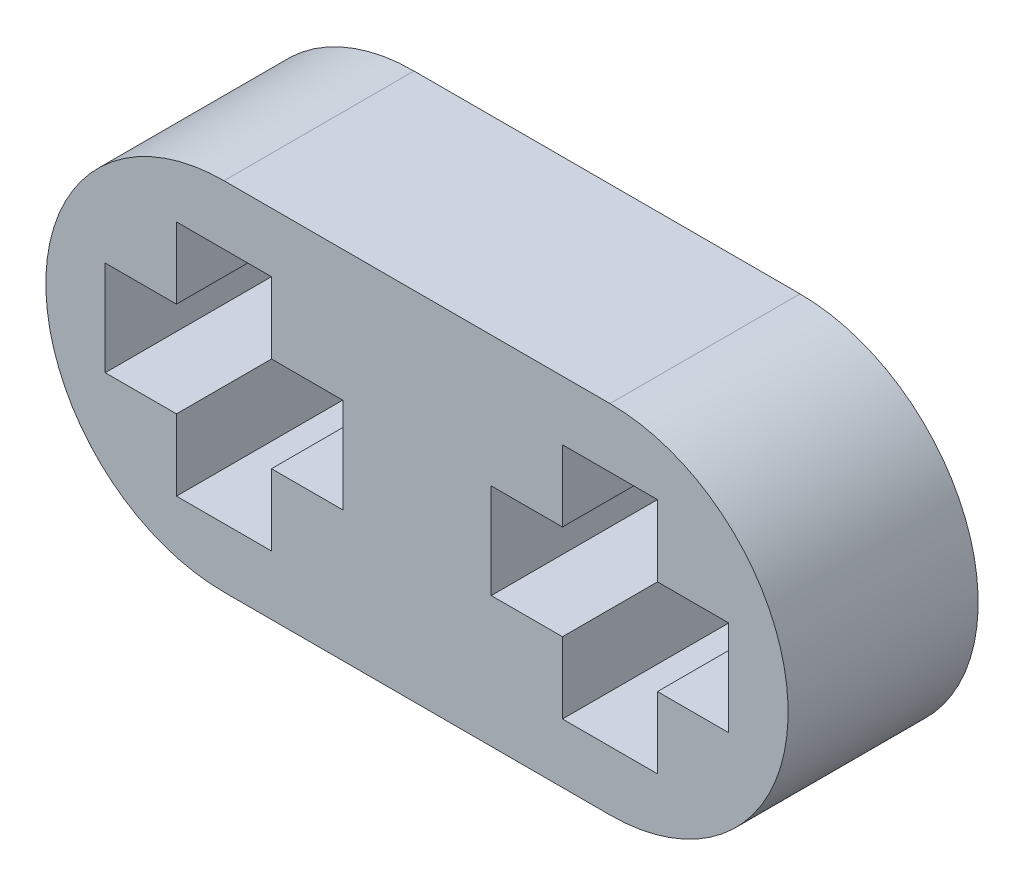
ISO-10303-21;
HEADER;
FILE_DESCRIPTION(('STEP AP214'),'2;1');
FILE_NAME('part.step','',(''),(''),'','','');
FILE_SCHEMA(('AUTOMOTIVE_DESIGN { 1 0 10303 214 1 1 1 1 }'));
ENDSEC;
DATA;
#1=APPLICATION_CONTEXT('core data for automotive mechanical design processes');
#2=APPLICATION_PROTOCOL_DEFINITION('international standard','automotive_design',2000,#1);
#3=PRODUCT_CONTEXT('',#1,'mechanical');
#4=PRODUCT('Part','Part','',(#3));
#5=PRODUCT_RELATED_PRODUCT_CATEGORY('part','',(#4));
#6=PRODUCT_DEFINITION_FORMATION('','',#4);
#7=PRODUCT_DEFINITION_CONTEXT('part definition',#1,'design');
#8=PRODUCT_DEFINITION('design','',#6,#7);
#9=PRODUCT_DEFINITION_SHAPE('','',#8);
#10=(LENGTH_UNIT() NAMED_UNIT(*) SI_UNIT(.MILLI.,.METRE.));
#11=(NAMED_UNIT(*) PLANE_ANGLE_UNIT() SI_UNIT($,.RADIAN.));
#12=(NAMED_UNIT(*) SI_UNIT($,.STERADIAN.) SOLID_ANGLE_UNIT());
#13=UNCERTAINTY_MEASURE_WITH_UNIT(LENGTH_MEASURE(1.E-05),#10,'distance_accuracy_value','');
#14=(GEOMETRIC_REPRESENTATION_CONTEXT(3) GLOBAL_UNCERTAINTY_ASSIGNED_CONTEXT((#13)) GLOBAL_UNIT_ASSIGNED_CONTEXT((#10,
#11,#12)) REPRESENTATION_CONTEXT('',''));
#15=CARTESIAN_POINT('',(0.,0.,0.));
#16=DIRECTION('',(0.,0.,1.));
#17=DIRECTION('',(1.,0.,0.));
#18=AXIS2_PLACEMENT_3D('',#15,#16,#17);
#19=CARTESIAN_POINT('',(4.0625,-3.75,4.));
#20=DIRECTION('',(0.,-1.,0.));
#21=DIRECTION('',(0.,0.,-1.));
#22=AXIS2_PLACEMENT_3D('',#19,#20,#21);
#23=PLANE('',#22);
#24=DIRECTION('',(-1.,0.,0.));
#25=VECTOR('',#24,1.);
#26=CARTESIAN_POINT('',(4.0625,-3.75,0.));
#27=LINE('',#26,#25);
#28=CARTESIAN_POINT('',(8.125,-3.75,0.));
#29=VERTEX_POINT('',#28);
#30=CARTESIAN_POINT('',(0.,-3.75,0.));
#31=VERTEX_POINT('',#30);
#32=EDGE_CURVE('E312',#29,#31,#27,.T.);
#33=ORIENTED_EDGE('',*,*,#32,.F.);
#34=DIRECTION('',(0.,0.,-1.));
#35=VECTOR('',#34,1.);
#36=CARTESIAN_POINT('',(8.125,-3.75,4.));
#37=LINE('',#36,#35);
#38=CARTESIAN_POINT('',(8.125,-3.75,4.));
#39=VERTEX_POINT('',#38);
#40=EDGE_CURVE('E11',#39,#29,#37,.T.);
#41=ORIENTED_EDGE('',*,*,#40,.F.);
#42=DIRECTION('',(-1.,0.,0.));
#43=VECTOR('',#42,1.);
#44=CARTESIAN_POINT('',(4.0625,-3.75,4.));
#45=LINE('',#44,#43);
#46=CARTESIAN_POINT('',(0.,-3.75,4.));
#47=VERTEX_POINT('',#46);
#48=EDGE_CURVE('E234',#39,#47,#45,.T.);
#49=ORIENTED_EDGE('',*,*,#48,.T.);
#50=DIRECTION('',(0.,0.,-1.));
#51=VECTOR('',#50,1.);
#52=CARTESIAN_POINT('',(0.,-3.75,4.));
#53=LINE('',#52,#51);
#54=EDGE_CURVE('E147',#47,#31,#53,.T.);
#55=ORIENTED_EDGE('',*,*,#54,.T.);
#56=EDGE_LOOP('',(#33,#41,#49,#55));
#57=FACE_BOUND('',#56,.T.);
#58=ADVANCED_FACE('F34',(#57),#23,.T.);
#59=CARTESIAN_POINT('',(8.125,0.,4.));
#60=DIRECTION('',(0.,0.,-1.));
#61=DIRECTION('',(-1.,0.,0.));
#62=AXIS2_PLACEMENT_3D('',#59,#60,#61);
#63=CYLINDRICAL_SURFACE('',#62,3.75);
#64=CARTESIAN_POINT('',(8.125,0.,0.));
#65=DIRECTION('',(0.,0.,1.));
#66=DIRECTION('',(1.,0.,0.));
#67=AXIS2_PLACEMENT_3D('',#64,#65,#66);
#68=CIRCLE('',#67,3.75);
#69=CARTESIAN_POINT('',(8.125,3.75,0.));
#70=VERTEX_POINT('',#69);
#71=EDGE_CURVE('E240',#29,#70,#68,.T.);
#72=ORIENTED_EDGE('',*,*,#71,.T.);
#73=DIRECTION('',(0.,0.,-1.));
#74=VECTOR('',#73,1.);
#75=CARTESIAN_POINT('',(8.125,3.75,4.));
#76=LINE('',#75,#74);
#77=CARTESIAN_POINT('',(8.125,3.75,4.));
#78=VERTEX_POINT('',#77);
#79=EDGE_CURVE('E44',#78,#70,#76,.T.);
#80=ORIENTED_EDGE('',*,*,#79,.F.);
#81=CARTESIAN_POINT('',(8.125,0.,4.));
#82=DIRECTION('',(0.,0.,1.));
#83=DIRECTION('',(1.,0.,0.));
#84=AXIS2_PLACEMENT_3D('',#81,#82,#83);
#85=CIRCLE('',#84,3.75);
#86=EDGE_CURVE('E229',#39,#78,#85,.T.);
#87=ORIENTED_EDGE('',*,*,#86,.F.);
#88=ORIENTED_EDGE('',*,*,#40,.T.);
#89=EDGE_LOOP('',(#72,#80,#87,#88));
#90=FACE_BOUND('',#89,.T.);
#91=ADVANCED_FACE('F238',(#90),#63,.T.);
#92=CARTESIAN_POINT('',(4.0625,3.75,4.));
#93=DIRECTION('',(0.,1.,0.));
#94=DIRECTION('',(0.,0.,1.));
#95=AXIS2_PLACEMENT_3D('',#92,#93,#94);
#96=PLANE('',#95);
#97=DIRECTION('',(1.,0.,0.));
#98=VECTOR('',#97,1.);
#99=CARTESIAN_POINT('',(4.0625,3.75,0.));
#100=LINE('',#99,#98);
#101=CARTESIAN_POINT('',(0.,3.75,0.));
#102=VERTEX_POINT('',#101);
#103=EDGE_CURVE('E316',#102,#70,#100,.T.);
#104=ORIENTED_EDGE('',*,*,#103,.F.);
#105=DIRECTION('',(0.,0.,-1.));
#106=VECTOR('',#105,1.);
#107=CARTESIAN_POINT('',(0.,3.75,4.));
#108=LINE('',#107,#106);
#109=CARTESIAN_POINT('',(0.,3.75,4.));
#110=VERTEX_POINT('',#109);
#111=EDGE_CURVE('E140',#110,#102,#108,.T.);
#112=ORIENTED_EDGE('',*,*,#111,.F.);
#113=DIRECTION('',(1.,0.,0.));
#114=VECTOR('',#113,1.);
#115=CARTESIAN_POINT('',(4.0625,3.75,4.));
#116=LINE('',#115,#114);
#117=EDGE_CURVE('E233',#110,#78,#116,.T.);
#118=ORIENTED_EDGE('',*,*,#117,.T.);
#119=ORIENTED_EDGE('',*,*,#79,.T.);
#120=EDGE_LOOP('',(#104,#112,#118,#119));
#121=FACE_BOUND('',#120,.T.);
#122=ADVANCED_FACE('F245',(#121),#96,.T.);
#123=CARTESIAN_POINT('',(4.0625,2.5,4.));
#124=DIRECTION('',(0.,-1.,0.));
#125=DIRECTION('',(0.,0.,-1.));
#126=AXIS2_PLACEMENT_3D('',#123,#124,#125);
#127=PLANE('',#126);
#128=DIRECTION('',(-1.,0.,0.));
#129=VECTOR('',#128,1.);
#130=CARTESIAN_POINT('',(4.0625,2.5,0.));
#131=LINE('',#130,#129);
#132=CARTESIAN_POINT('',(0.999999999999999,2.5,0.));
#133=VERTEX_POINT('',#132);
#134=CARTESIAN_POINT('',(-1.,2.5,0.));
#135=VERTEX_POINT('',#134);
#136=EDGE_CURVE('E276',#133,#135,#131,.T.);
#137=ORIENTED_EDGE('',*,*,#136,.F.);
#138=DIRECTION('',(0.,0.,-1.));
#139=VECTOR('',#138,1.);
#140=CARTESIAN_POINT('',(0.999999999999999,2.5,4.));
#141=LINE('',#140,#139);
#142=CARTESIAN_POINT('',(0.999999999999999,2.5,4.));
#143=VERTEX_POINT('',#142);
#144=EDGE_CURVE('E322',#143,#133,#141,.T.);
#145=ORIENTED_EDGE('',*,*,#144,.F.);
#146=DIRECTION('',(-1.,0.,0.));
#147=VECTOR('',#146,1.);
#148=CARTESIAN_POINT('',(4.0625,2.5,4.));
#149=LINE('',#148,#147);
#150=CARTESIAN_POINT('',(-1.,2.5,4.));
#151=VERTEX_POINT('',#150);
#152=EDGE_CURVE('E423',#143,#151,#149,.T.);
#153=ORIENTED_EDGE('',*,*,#152,.T.);
#154=DIRECTION('',(0.,0.,-1.));
#155=VECTOR('',#154,1.);
#156=CARTESIAN_POINT('',(-1.,2.5,4.));
#157=LINE('',#156,#155);
#158=EDGE_CURVE('E324',#151,#135,#157,.T.);
#159=ORIENTED_EDGE('',*,*,#158,.T.);
#160=EDGE_LOOP('',(#137,#145,#153,#159));
#161=FACE_BOUND('',#160,.T.);
#162=ADVANCED_FACE('F523',(#161),#127,.T.);
#163=CARTESIAN_POINT('',(0.999999999999999,-13.6223830476375,4.));
#164=DIRECTION('',(-1.,0.,0.));
#165=DIRECTION('',(0.,0.,1.));
#166=AXIS2_PLACEMENT_3D('',#163,#164,#165);
#167=PLANE('',#166);
#168=DIRECTION('',(0.,1.,0.));
#169=VECTOR('',#168,1.);
#170=CARTESIAN_POINT('',(0.999999999999999,-13.6223830476375,0.));
#171=LINE('',#170,#169);
#172=CARTESIAN_POINT('',(0.999999999999999,0.999999999999999,0.));
#173=VERTEX_POINT('',#172);
#174=EDGE_CURVE('E279',#173,#133,#171,.T.);
#175=ORIENTED_EDGE('',*,*,#174,.F.);
#176=DIRECTION('',(0.,0.,-1.));
#177=VECTOR('',#176,1.);
#178=CARTESIAN_POINT('',(0.999999999999999,0.999999999999999,4.));
#179=LINE('',#178,#177);
#180=CARTESIAN_POINT('',(0.999999999999999,0.999999999999999,4.));
#181=VERTEX_POINT('',#180);
#182=EDGE_CURVE('E344',#181,#173,#179,.T.);
#183=ORIENTED_EDGE('',*,*,#182,.F.);
#184=DIRECTION('',(0.,1.,0.));
#185=VECTOR('',#184,1.);
#186=CARTESIAN_POINT('',(0.999999999999999,-13.6223830476375,4.));
#187=LINE('',#186,#185);
#188=EDGE_CURVE('E426',#181,#143,#187,.T.);
#189=ORIENTED_EDGE('',*,*,#188,.T.);
#190=ORIENTED_EDGE('',*,*,#144,.T.);
#191=EDGE_LOOP('',(#175,#183,#189,#190));
#192=FACE_BOUND('',#191,.T.);
#193=ADVANCED_FACE('F519',(#192),#167,.T.);
#194=CARTESIAN_POINT('',(4.0625,1.,4.));
#195=DIRECTION('',(0.,-1.,0.));
#196=DIRECTION('',(0.,0.,-1.));
#197=AXIS2_PLACEMENT_3D('',#194,#195,#196);
#198=PLANE('',#197);
#199=DIRECTION('',(-1.,0.,0.));
#200=VECTOR('',#199,1.);
#201=CARTESIAN_POINT('',(4.0625,1.,0.));
#202=LINE('',#201,#200);
#203=CARTESIAN_POINT('',(2.5,1.,0.));
#204=VERTEX_POINT('',#203);
#205=EDGE_CURVE('E282',#204,#173,#202,.T.);
#206=ORIENTED_EDGE('',*,*,#205,.F.);
#207=DIRECTION('',(0.,0.,-1.));
#208=VECTOR('',#207,1.);
#209=CARTESIAN_POINT('',(2.5,1.,4.));
#210=LINE('',#209,#208);
#211=CARTESIAN_POINT('',(2.5,1.,4.));
#212=VERTEX_POINT('',#211);
#213=EDGE_CURVE('E342',#212,#204,#210,.T.);
#214=ORIENTED_EDGE('',*,*,#213,.F.);
#215=DIRECTION('',(-1.,0.,0.));
#216=VECTOR('',#215,1.);
#217=CARTESIAN_POINT('',(4.0625,1.,4.));
#218=LINE('',#217,#216);
#219=EDGE_CURVE('E429',#212,#181,#218,.T.);
#220=ORIENTED_EDGE('',*,*,#219,.T.);
#221=ORIENTED_EDGE('',*,*,#182,.T.);
#222=EDGE_LOOP('',(#206,#214,#220,#221));
#223=FACE_BOUND('',#222,.T.);
#224=ADVANCED_FACE('F515',(#223),#198,.T.);
#225=CARTESIAN_POINT('',(2.5,-13.6223830476375,4.));
#226=DIRECTION('',(-1.,0.,0.));
#227=DIRECTION('',(0.,0.,1.));
#228=AXIS2_PLACEMENT_3D('',#225,#226,#227);
#229=PLANE('',#228);
#230=DIRECTION('',(0.,1.,0.));
#231=VECTOR('',#230,1.);
#232=CARTESIAN_POINT('',(2.5,-13.6223830476375,0.));
#233=LINE('',#232,#231);
#234=CARTESIAN_POINT('',(2.5,-1.,0.));
#235=VERTEX_POINT('',#234);
#236=EDGE_CURVE('E285',#235,#204,#233,.T.);
#237=ORIENTED_EDGE('',*,*,#236,.F.);
#238=DIRECTION('',(0.,0.,-1.));
#239=VECTOR('',#238,1.);
#240=CARTESIAN_POINT('',(2.5,-1.,4.));
#241=LINE('',#240,#239);
#242=CARTESIAN_POINT('',(2.5,-1.,4.));
#243=VERTEX_POINT('',#242);
#244=EDGE_CURVE('E340',#243,#235,#241,.T.);
#245=ORIENTED_EDGE('',*,*,#244,.F.);
#246=DIRECTION('',(0.,1.,0.));
#247=VECTOR('',#246,1.);
#248=CARTESIAN_POINT('',(2.5,-13.6223830476375,4.));
#249=LINE('',#248,#247);
#250=EDGE_CURVE('E432',#243,#212,#249,.T.);
#251=ORIENTED_EDGE('',*,*,#250,.T.);
#252=ORIENTED_EDGE('',*,*,#213,.T.);
#253=EDGE_LOOP('',(#237,#245,#251,#252));
#254=FACE_BOUND('',#253,.T.);
#255=ADVANCED_FACE('F511',(#254),#229,.T.);
#256=CARTESIAN_POINT('',(4.0625,-1.,4.));
#257=DIRECTION('',(0.,1.,0.));
#258=DIRECTION('',(-1.,0.,0.));
#259=AXIS2_PLACEMENT_3D('',#256,#257,#258);
#260=PLANE('',#259);
#261=DIRECTION('',(1.,0.,0.));
#262=VECTOR('',#261,1.);
#263=CARTESIAN_POINT('',(4.0625,-1.,0.));
#264=LINE('',#263,#262);
#265=CARTESIAN_POINT('',(1.,-1.,0.));
#266=VERTEX_POINT('',#265);
#267=EDGE_CURVE('E288',#266,#235,#264,.T.);
#268=ORIENTED_EDGE('',*,*,#267,.F.);
#269=DIRECTION('',(0.,0.,-1.));
#270=VECTOR('',#269,1.);
#271=CARTESIAN_POINT('',(1.,-1.,4.));
#272=LINE('',#271,#270);
#273=CARTESIAN_POINT('',(1.,-1.,4.));
#274=VERTEX_POINT('',#273);
#275=EDGE_CURVE('E338',#274,#266,#272,.T.);
#276=ORIENTED_EDGE('',*,*,#275,.F.);
#277=DIRECTION('',(1.,0.,0.));
#278=VECTOR('',#277,1.);
#279=CARTESIAN_POINT('',(4.0625,-1.,4.));
#280=LINE('',#279,#278);
#281=EDGE_CURVE('E435',#274,#243,#280,.T.);
#282=ORIENTED_EDGE('',*,*,#281,.T.);
#283=ORIENTED_EDGE('',*,*,#244,.T.);
#284=EDGE_LOOP('',(#268,#276,#282,#283));
#285=FACE_BOUND('',#284,.T.);
#286=ADVANCED_FACE('F507',(#285),#260,.T.);
#287=CARTESIAN_POINT('',(0.999999999999999,-13.6223830476375,4.));
#288=DIRECTION('',(-1.,0.,0.));
#289=DIRECTION('',(0.,0.,1.));
#290=AXIS2_PLACEMENT_3D('',#287,#288,#289);
#291=PLANE('',#290);
#292=DIRECTION('',(0.,1.,0.));
#293=VECTOR('',#292,1.);
#294=CARTESIAN_POINT('',(0.999999999999999,-13.6223830476375,0.));
#295=LINE('',#294,#293);
#296=CARTESIAN_POINT('',(0.999999999999999,-2.5,0.));
#297=VERTEX_POINT('',#296);
#298=EDGE_CURVE('E291',#297,#266,#295,.T.);
#299=ORIENTED_EDGE('',*,*,#298,.F.);
#300=DIRECTION('',(0.,0.,-1.));
#301=VECTOR('',#300,1.);
#302=CARTESIAN_POINT('',(0.999999999999999,-2.5,4.));
#303=LINE('',#302,#301);
#304=CARTESIAN_POINT('',(0.999999999999999,-2.5,4.));
#305=VERTEX_POINT('',#304);
#306=EDGE_CURVE('E336',#305,#297,#303,.T.);
#307=ORIENTED_EDGE('',*,*,#306,.F.);
#308=DIRECTION('',(0.,1.,0.));
#309=VECTOR('',#308,1.);
#310=CARTESIAN_POINT('',(0.999999999999999,-13.6223830476375,4.));
#311=LINE('',#310,#309);
#312=EDGE_CURVE('E438',#305,#274,#311,.T.);
#313=ORIENTED_EDGE('',*,*,#312,.T.);
#314=ORIENTED_EDGE('',*,*,#275,.T.);
#315=EDGE_LOOP('',(#299,#307,#313,#314));
#316=FACE_BOUND('',#315,.T.);
#317=ADVANCED_FACE('F503',(#316),#291,.T.);
#318=CARTESIAN_POINT('',(4.0625,-2.5,4.));
#319=DIRECTION('',(0.,1.,0.));
#320=DIRECTION('',(-1.,0.,0.));
#321=AXIS2_PLACEMENT_3D('',#318,#319,#320);
#322=PLANE('',#321);
#323=DIRECTION('',(1.,0.,0.));
#324=VECTOR('',#323,1.);
#325=CARTESIAN_POINT('',(4.0625,-2.5,0.));
#326=LINE('',#325,#324);
#327=CARTESIAN_POINT('',(-1.,-2.5,0.));
#328=VERTEX_POINT('',#327);
#329=EDGE_CURVE('E294',#328,#297,#326,.T.);
#330=ORIENTED_EDGE('',*,*,#329,.F.);
#331=DIRECTION('',(0.,0.,-1.));
#332=VECTOR('',#331,1.);
#333=CARTESIAN_POINT('',(-1.,-2.5,4.));
#334=LINE('',#333,#332);
#335=CARTESIAN_POINT('',(-1.,-2.5,4.));
#336=VERTEX_POINT('',#335);
#337=EDGE_CURVE('E334',#336,#328,#334,.T.);
#338=ORIENTED_EDGE('',*,*,#337,.F.);
#339=DIRECTION('',(1.,0.,0.));
#340=VECTOR('',#339,1.);
#341=CARTESIAN_POINT('',(4.0625,-2.5,4.));
#342=LINE('',#341,#340);
#343=EDGE_CURVE('E441',#336,#305,#342,.T.);
#344=ORIENTED_EDGE('',*,*,#343,.T.);
#345=ORIENTED_EDGE('',*,*,#306,.T.);
#346=EDGE_LOOP('',(#330,#338,#344,#345));
#347=FACE_BOUND('',#346,.T.);
#348=ADVANCED_FACE('F499',(#347),#322,.T.);
#349=CARTESIAN_POINT('',(-1.,-13.6223830476375,4.));
#350=DIRECTION('',(1.,0.,0.));
#351=DIRECTION('',(0.,0.,-1.));
#352=AXIS2_PLACEMENT_3D('',#349,#350,#351);
#353=PLANE('',#352);
#354=DIRECTION('',(0.,-1.,0.));
#355=VECTOR('',#354,1.);
#356=CARTESIAN_POINT('',(-1.,-13.6223830476375,0.));
#357=LINE('',#356,#355);
#358=CARTESIAN_POINT('',(-1.,-0.999999999999999,0.));
#359=VERTEX_POINT('',#358);
#360=EDGE_CURVE('E297',#359,#328,#357,.T.);
#361=ORIENTED_EDGE('',*,*,#360,.F.);
#362=DIRECTION('',(0.,0.,-1.));
#363=VECTOR('',#362,1.);
#364=CARTESIAN_POINT('',(-1.,-0.999999999999999,4.));
#365=LINE('',#364,#363);
#366=CARTESIAN_POINT('',(-1.,-0.999999999999999,4.));
#367=VERTEX_POINT('',#366);
#368=EDGE_CURVE('E332',#367,#359,#365,.T.);
#369=ORIENTED_EDGE('',*,*,#368,.F.);
#370=DIRECTION('',(0.,-1.,0.));
#371=VECTOR('',#370,1.);
#372=CARTESIAN_POINT('',(-1.,-13.6223830476375,4.));
#373=LINE('',#372,#371);
#374=EDGE_CURVE('E444',#367,#336,#373,.T.);
#375=ORIENTED_EDGE('',*,*,#374,.T.);
#376=ORIENTED_EDGE('',*,*,#337,.T.);
#377=EDGE_LOOP('',(#361,#369,#375,#376));
#378=FACE_BOUND('',#377,.T.);
#379=ADVANCED_FACE('F495',(#378),#353,.T.);
#380=CARTESIAN_POINT('',(4.0625,-1.,4.));
#381=DIRECTION('',(0.,1.,0.));
#382=DIRECTION('',(0.,0.,1.));
#383=AXIS2_PLACEMENT_3D('',#380,#381,#382);
#384=PLANE('',#383);
#385=DIRECTION('',(1.,0.,0.));
#386=VECTOR('',#385,1.);
#387=CARTESIAN_POINT('',(4.0625,-1.,0.));
#388=LINE('',#387,#386);
#389=CARTESIAN_POINT('',(-2.5,-1.,0.));
#390=VERTEX_POINT('',#389);
#391=EDGE_CURVE('E300',#390,#359,#388,.T.);
#392=ORIENTED_EDGE('',*,*,#391,.F.);
#393=DIRECTION('',(0.,0.,-1.));
#394=VECTOR('',#393,1.);
#395=CARTESIAN_POINT('',(-2.5,-1.,4.));
#396=LINE('',#395,#394);
#397=CARTESIAN_POINT('',(-2.5,-1.,4.));
#398=VERTEX_POINT('',#397);
#399=EDGE_CURVE('E330',#398,#390,#396,.T.);
#400=ORIENTED_EDGE('',*,*,#399,.F.);
#401=DIRECTION('',(1.,0.,0.));
#402=VECTOR('',#401,1.);
#403=CARTESIAN_POINT('',(4.0625,-1.,4.));
#404=LINE('',#403,#402);
#405=EDGE_CURVE('E447',#398,#367,#404,.T.);
#406=ORIENTED_EDGE('',*,*,#405,.T.);
#407=ORIENTED_EDGE('',*,*,#368,.T.);
#408=EDGE_LOOP('',(#392,#400,#406,#407));
#409=FACE_BOUND('',#408,.T.);
#410=ADVANCED_FACE('F491',(#409),#384,.T.);
#411=CARTESIAN_POINT('',(-2.5,-13.6223830476375,4.));
#412=DIRECTION('',(1.,0.,0.));
#413=DIRECTION('',(0.,0.,-1.));
#414=AXIS2_PLACEMENT_3D('',#411,#412,#413);
#415=PLANE('',#414);
#416=DIRECTION('',(0.,-1.,0.));
#417=VECTOR('',#416,1.);
#418=CARTESIAN_POINT('',(-2.5,-13.6223830476375,0.));
#419=LINE('',#418,#417);
#420=CARTESIAN_POINT('',(-2.5,1.,0.));
#421=VERTEX_POINT('',#420);
#422=EDGE_CURVE('E303',#421,#390,#419,.T.);
#423=ORIENTED_EDGE('',*,*,#422,.F.);
#424=DIRECTION('',(0.,0.,-1.));
#425=VECTOR('',#424,1.);
#426=CARTESIAN_POINT('',(-2.5,1.,4.));
#427=LINE('',#426,#425);
#428=CARTESIAN_POINT('',(-2.5,1.,4.));
#429=VERTEX_POINT('',#428);
#430=EDGE_CURVE('E328',#429,#421,#427,.T.);
#431=ORIENTED_EDGE('',*,*,#430,.F.);
#432=DIRECTION('',(0.,-1.,0.));
#433=VECTOR('',#432,1.);
#434=CARTESIAN_POINT('',(-2.5,-13.6223830476375,4.));
#435=LINE('',#434,#433);
#436=EDGE_CURVE('E450',#429,#398,#435,.T.);
#437=ORIENTED_EDGE('',*,*,#436,.T.);
#438=ORIENTED_EDGE('',*,*,#399,.T.);
#439=EDGE_LOOP('',(#423,#431,#437,#438));
#440=FACE_BOUND('',#439,.T.);
#441=ADVANCED_FACE('F487',(#440),#415,.T.);
#442=CARTESIAN_POINT('',(4.0625,1.,4.));
#443=DIRECTION('',(0.,-1.,0.));
#444=DIRECTION('',(0.,0.,-1.));
#445=AXIS2_PLACEMENT_3D('',#442,#443,#444);
#446=PLANE('',#445);
#447=DIRECTION('',(-1.,0.,0.));
#448=VECTOR('',#447,1.);
#449=CARTESIAN_POINT('',(4.0625,1.,0.));
#450=LINE('',#449,#448);
#451=CARTESIAN_POINT('',(-1.,1.,0.));
#452=VERTEX_POINT('',#451);
#453=EDGE_CURVE('E306',#452,#421,#450,.T.);
#454=ORIENTED_EDGE('',*,*,#453,.F.);
#455=DIRECTION('',(0.,0.,-1.));
#456=VECTOR('',#455,1.);
#457=CARTESIAN_POINT('',(-1.,1.,4.));
#458=LINE('',#457,#456);
#459=CARTESIAN_POINT('',(-1.,1.,4.));
#460=VERTEX_POINT('',#459);
#461=EDGE_CURVE('E326',#460,#452,#458,.T.);
#462=ORIENTED_EDGE('',*,*,#461,.F.);
#463=DIRECTION('',(-1.,0.,0.));
#464=VECTOR('',#463,1.);
#465=CARTESIAN_POINT('',(4.0625,1.,4.));
#466=LINE('',#465,#464);
#467=EDGE_CURVE('E453',#460,#429,#466,.T.);
#468=ORIENTED_EDGE('',*,*,#467,.T.);
#469=ORIENTED_EDGE('',*,*,#430,.T.);
#470=EDGE_LOOP('',(#454,#462,#468,#469));
#471=FACE_BOUND('',#470,.T.);
#472=ADVANCED_FACE('F484',(#471),#446,.T.);
#473=CARTESIAN_POINT('',(4.0625,-1.,4.));
#474=DIRECTION('',(0.,-1.,0.));
#475=DIRECTION('',(1.,0.,0.));
#476=AXIS2_PLACEMENT_3D('',#473,#474,#475);
#477=PLANE('',#476);
#478=DIRECTION('',(-1.,0.,0.));
#479=VECTOR('',#478,1.);
#480=CARTESIAN_POINT('',(4.0625,-1.,0.));
#481=LINE('',#480,#479);
#482=CARTESIAN_POINT('',(7.125,-0.999999999999999,0.));
#483=VERTEX_POINT('',#482);
#484=CARTESIAN_POINT('',(5.625,-1.,0.));
#485=VERTEX_POINT('',#484);
#486=EDGE_CURVE('E251',#483,#485,#481,.T.);
#487=ORIENTED_EDGE('',*,*,#486,.T.);
#488=DIRECTION('',(0.,0.,-1.));
#489=VECTOR('',#488,1.);
#490=CARTESIAN_POINT('',(5.625,-1.,4.));
#491=LINE('',#490,#489);
#492=CARTESIAN_POINT('',(5.625,-1.,4.));
#493=VERTEX_POINT('',#492);
#494=EDGE_CURVE('E38',#493,#485,#491,.T.);
#495=ORIENTED_EDGE('',*,*,#494,.F.);
#496=DIRECTION('',(-1.,0.,0.));
#497=VECTOR('',#496,1.);
#498=CARTESIAN_POINT('',(4.0625,-1.,4.));
#499=LINE('',#498,#497);
#500=CARTESIAN_POINT('',(7.125,-0.999999999999999,4.));
#501=VERTEX_POINT('',#500);
#502=EDGE_CURVE('E320',#501,#493,#499,.T.);
#503=ORIENTED_EDGE('',*,*,#502,.F.);
#504=DIRECTION('',(0.,0.,-1.));
#505=VECTOR('',#504,1.);
#506=CARTESIAN_POINT('',(7.125,-0.999999999999999,4.));
#507=LINE('',#506,#505);
#508=EDGE_CURVE('E247',#501,#483,#507,.T.);
#509=ORIENTED_EDGE('',*,*,#508,.T.);
#510=EDGE_LOOP('',(#487,#495,#503,#509));
#511=FACE_BOUND('',#510,.T.);
#512=ADVANCED_FACE('F36',(#511),#477,.F.);
#513=CARTESIAN_POINT('',(5.625,-13.6223830476375,4.));
#514=DIRECTION('',(-1.,0.,0.));
#515=DIRECTION('',(0.,0.,1.));
#516=AXIS2_PLACEMENT_3D('',#513,#514,#515);
#517=PLANE('',#516);
#518=DIRECTION('',(0.,1.,0.));
#519=VECTOR('',#518,1.);
#520=CARTESIAN_POINT('',(5.625,-13.6223830476375,0.));
#521=LINE('',#520,#519);
#522=CARTESIAN_POINT('',(5.625,1.,0.));
#523=VERTEX_POINT('',#522);
#524=EDGE_CURVE('E254',#485,#523,#521,.T.);
#525=ORIENTED_EDGE('',*,*,#524,.T.);
#526=DIRECTION('',(0.,0.,-1.));
#527=VECTOR('',#526,1.);
#528=CARTESIAN_POINT('',(5.625,1.,4.));
#529=LINE('',#528,#527);
#530=CARTESIAN_POINT('',(5.625,1.,4.));
#531=VERTEX_POINT('',#530);
#532=EDGE_CURVE('E375',#531,#523,#529,.T.);
#533=ORIENTED_EDGE('',*,*,#532,.F.);
#534=DIRECTION('',(0.,1.,0.));
#535=VECTOR('',#534,1.);
#536=CARTESIAN_POINT('',(5.625,-13.6223830476375,4.));
#537=LINE('',#536,#535);
#538=EDGE_CURVE('E155',#493,#531,#537,.T.);
#539=ORIENTED_EDGE('',*,*,#538,.F.);
#540=ORIENTED_EDGE('',*,*,#494,.T.);
#541=EDGE_LOOP('',(#525,#533,#539,#540));
#542=FACE_BOUND('',#541,.T.);
#543=ADVANCED_FACE('F381',(#542),#517,.F.);
#544=CARTESIAN_POINT('',(4.0625,1.,4.));
#545=DIRECTION('',(0.,1.,0.));
#546=DIRECTION('',(0.,0.,1.));
#547=AXIS2_PLACEMENT_3D('',#544,#545,#546);
#548=PLANE('',#547);
#549=DIRECTION('',(1.,0.,0.));
#550=VECTOR('',#549,1.);
#551=CARTESIAN_POINT('',(4.0625,1.,0.));
#552=LINE('',#551,#550);
#553=CARTESIAN_POINT('',(7.125,1.,0.));
#554=VERTEX_POINT('',#553);
#555=EDGE_CURVE('E256',#523,#554,#552,.T.);
#556=ORIENTED_EDGE('',*,*,#555,.T.);
#557=DIRECTION('',(0.,0.,-1.));
#558=VECTOR('',#557,1.);
#559=CARTESIAN_POINT('',(7.125,1.,4.));
#560=LINE('',#559,#558);
#561=CARTESIAN_POINT('',(7.125,1.,4.));
#562=VERTEX_POINT('',#561);
#563=EDGE_CURVE('E373',#562,#554,#560,.T.);
#564=ORIENTED_EDGE('',*,*,#563,.F.);
#565=DIRECTION('',(1.,0.,0.));
#566=VECTOR('',#565,1.);
#567=CARTESIAN_POINT('',(4.0625,1.,4.));
#568=LINE('',#567,#566);
#569=EDGE_CURVE('E403',#531,#562,#568,.T.);
#570=ORIENTED_EDGE('',*,*,#569,.F.);
#571=ORIENTED_EDGE('',*,*,#532,.T.);
#572=EDGE_LOOP('',(#556,#564,#570,#571));
#573=FACE_BOUND('',#572,.T.);
#574=ADVANCED_FACE('F394',(#573),#548,.F.);
#575=CARTESIAN_POINT('',(7.125,-13.6223830476375,4.));
#576=DIRECTION('',(-1.,0.,0.));
#577=DIRECTION('',(0.,0.,1.));
#578=AXIS2_PLACEMENT_3D('',#575,#576,#577);
#579=PLANE('',#578);
#580=DIRECTION('',(0.,1.,0.));
#581=VECTOR('',#580,1.);
#582=CARTESIAN_POINT('',(7.125,-13.6223830476375,0.));
#583=LINE('',#582,#581);
#584=CARTESIAN_POINT('',(7.125,2.5,0.));
#585=VERTEX_POINT('',#584);
#586=EDGE_CURVE('E258',#554,#585,#583,.T.);
#587=ORIENTED_EDGE('',*,*,#586,.T.);
#588=DIRECTION('',(0.,0.,-1.));
#589=VECTOR('',#588,1.);
#590=CARTESIAN_POINT('',(7.125,2.5,4.));
#591=LINE('',#590,#589);
#592=CARTESIAN_POINT('',(7.125,2.5,4.));
#593=VERTEX_POINT('',#592);
#594=EDGE_CURVE('E370',#593,#585,#591,.T.);
#595=ORIENTED_EDGE('',*,*,#594,.F.);
#596=DIRECTION('',(0.,1.,0.));
#597=VECTOR('',#596,1.);
#598=CARTESIAN_POINT('',(7.125,-13.6223830476375,4.));
#599=LINE('',#598,#597);
#600=EDGE_CURVE('E399',#562,#593,#599,.T.);
#601=ORIENTED_EDGE('',*,*,#600,.F.);
#602=ORIENTED_EDGE('',*,*,#563,.T.);
#603=EDGE_LOOP('',(#587,#595,#601,#602));
#604=FACE_BOUND('',#603,.T.);
#605=ADVANCED_FACE('F397',(#604),#579,.F.);
#606=CARTESIAN_POINT('',(4.0625,2.5,4.));
#607=DIRECTION('',(0.,1.,0.));
#608=DIRECTION('',(0.,0.,1.));
#609=AXIS2_PLACEMENT_3D('',#606,#607,#608);
#610=PLANE('',#609);
#611=DIRECTION('',(1.,0.,0.));
#612=VECTOR('',#611,1.);
#613=CARTESIAN_POINT('',(4.0625,2.5,0.));
#614=LINE('',#613,#612);
#615=CARTESIAN_POINT('',(9.125,2.5,0.));
#616=VERTEX_POINT('',#615);
#617=EDGE_CURVE('E260',#585,#616,#614,.T.);
#618=ORIENTED_EDGE('',*,*,#617,.T.);
#619=DIRECTION('',(0.,0.,-1.));
#620=VECTOR('',#619,1.);
#621=CARTESIAN_POINT('',(9.125,2.5,4.));
#622=LINE('',#621,#620);
#623=CARTESIAN_POINT('',(9.125,2.5,4.));
#624=VERTEX_POINT('',#623);
#625=EDGE_CURVE('E367',#624,#616,#622,.T.);
#626=ORIENTED_EDGE('',*,*,#625,.F.);
#627=DIRECTION('',(1.,0.,0.));
#628=VECTOR('',#627,1.);
#629=CARTESIAN_POINT('',(4.0625,2.5,4.));
#630=LINE('',#629,#628);
#631=EDGE_CURVE('E402',#593,#624,#630,.T.);
#632=ORIENTED_EDGE('',*,*,#631,.F.);
#633=ORIENTED_EDGE('',*,*,#594,.T.);
#634=EDGE_LOOP('',(#618,#626,#632,#633));
#635=FACE_BOUND('',#634,.T.);
#636=ADVANCED_FACE('F550',(#635),#610,.F.);
#637=CARTESIAN_POINT('',(9.125,-13.6223830476375,4.));
#638=DIRECTION('',(1.,0.,0.));
#639=DIRECTION('',(0.,0.,-1.));
#640=AXIS2_PLACEMENT_3D('',#637,#638,#639);
#641=PLANE('',#640);
#642=DIRECTION('',(0.,-1.,0.));
#643=VECTOR('',#642,1.);
#644=CARTESIAN_POINT('',(9.125,-13.6223830476375,0.));
#645=LINE('',#644,#643);
#646=CARTESIAN_POINT('',(9.125,0.999999999999999,0.));
#647=VERTEX_POINT('',#646);
#648=EDGE_CURVE('E262',#616,#647,#645,.T.);
#649=ORIENTED_EDGE('',*,*,#648,.T.);
#650=DIRECTION('',(0.,0.,-1.));
#651=VECTOR('',#650,1.);
#652=CARTESIAN_POINT('',(9.125,0.999999999999999,4.));
#653=LINE('',#652,#651);
#654=CARTESIAN_POINT('',(9.125,0.999999999999999,4.));
#655=VERTEX_POINT('',#654);
#656=EDGE_CURVE('E364',#655,#647,#653,.T.);
#657=ORIENTED_EDGE('',*,*,#656,.F.);
#658=DIRECTION('',(0.,-1.,0.));
#659=VECTOR('',#658,1.);
#660=CARTESIAN_POINT('',(9.125,-13.6223830476375,4.));
#661=LINE('',#660,#659);
#662=EDGE_CURVE('E405',#624,#655,#661,.T.);
#663=ORIENTED_EDGE('',*,*,#662,.F.);
#664=ORIENTED_EDGE('',*,*,#625,.T.);
#665=EDGE_LOOP('',(#649,#657,#663,#664));
#666=FACE_BOUND('',#665,.T.);
#667=ADVANCED_FACE('F546',(#666),#641,.F.);
#668=CARTESIAN_POINT('',(4.0625,1.,4.));
#669=DIRECTION('',(0.,1.,0.));
#670=DIRECTION('',(0.,0.,1.));
#671=AXIS2_PLACEMENT_3D('',#668,#669,#670);
#672=PLANE('',#671);
#673=DIRECTION('',(1.,0.,0.));
#674=VECTOR('',#673,1.);
#675=CARTESIAN_POINT('',(4.0625,1.,0.));
#676=LINE('',#675,#674);
#677=CARTESIAN_POINT('',(10.625,1.,0.));
#678=VERTEX_POINT('',#677);
#679=EDGE_CURVE('E264',#647,#678,#676,.T.);
#680=ORIENTED_EDGE('',*,*,#679,.T.);
#681=DIRECTION('',(0.,0.,-1.));
#682=VECTOR('',#681,1.);
#683=CARTESIAN_POINT('',(10.625,1.,4.));
#684=LINE('',#683,#682);
#685=CARTESIAN_POINT('',(10.625,1.,4.));
#686=VERTEX_POINT('',#685);
#687=EDGE_CURVE('E361',#686,#678,#684,.T.);
#688=ORIENTED_EDGE('',*,*,#687,.F.);
#689=DIRECTION('',(1.,0.,0.));
#690=VECTOR('',#689,1.);
#691=CARTESIAN_POINT('',(4.0625,1.,4.));
#692=LINE('',#691,#690);
#693=EDGE_CURVE('E411',#655,#686,#692,.T.);
#694=ORIENTED_EDGE('',*,*,#693,.F.);
#695=ORIENTED_EDGE('',*,*,#656,.T.);
#696=EDGE_LOOP('',(#680,#688,#694,#695));
#697=FACE_BOUND('',#696,.T.);
#698=ADVANCED_FACE('F542',(#697),#672,.F.);
#699=CARTESIAN_POINT('',(10.625,-13.6223830476375,4.));
#700=DIRECTION('',(1.,0.,0.));
#701=DIRECTION('',(0.,0.,-1.));
#702=AXIS2_PLACEMENT_3D('',#699,#700,#701);
#703=PLANE('',#702);
#704=DIRECTION('',(0.,-1.,0.));
#705=VECTOR('',#704,1.);
#706=CARTESIAN_POINT('',(10.625,-13.6223830476375,0.));
#707=LINE('',#706,#705);
#708=CARTESIAN_POINT('',(10.625,-1.,0.));
#709=VERTEX_POINT('',#708);
#710=EDGE_CURVE('E266',#678,#709,#707,.T.);
#711=ORIENTED_EDGE('',*,*,#710,.T.);
#712=DIRECTION('',(0.,0.,-1.));
#713=VECTOR('',#712,1.);
#714=CARTESIAN_POINT('',(10.625,-1.,4.));
#715=LINE('',#714,#713);
#716=CARTESIAN_POINT('',(10.625,-1.,4.));
#717=VERTEX_POINT('',#716);
#718=EDGE_CURVE('E358',#717,#709,#715,.T.);
#719=ORIENTED_EDGE('',*,*,#718,.F.);
#720=DIRECTION('',(0.,-1.,0.));
#721=VECTOR('',#720,1.);
#722=CARTESIAN_POINT('',(10.625,-13.6223830476375,4.));
#723=LINE('',#722,#721);
#724=EDGE_CURVE('E413',#686,#717,#723,.T.);
#725=ORIENTED_EDGE('',*,*,#724,.F.);
#726=ORIENTED_EDGE('',*,*,#687,.T.);
#727=EDGE_LOOP('',(#711,#719,#725,#726));
#728=FACE_BOUND('',#727,.T.);
#729=ADVANCED_FACE('F538',(#728),#703,.F.);
#730=CARTESIAN_POINT('',(4.0625,-1.,4.));
#731=DIRECTION('',(0.,-1.,0.));
#732=DIRECTION('',(0.,0.,-1.));
#733=AXIS2_PLACEMENT_3D('',#730,#731,#732);
#734=PLANE('',#733);
#735=DIRECTION('',(-1.,0.,0.));
#736=VECTOR('',#735,1.);
#737=CARTESIAN_POINT('',(4.0625,-1.,0.));
#738=LINE('',#737,#736);
#739=CARTESIAN_POINT('',(9.125,-1.,0.));
#740=VERTEX_POINT('',#739);
#741=EDGE_CURVE('E268',#709,#740,#738,.T.);
#742=ORIENTED_EDGE('',*,*,#741,.T.);
#743=DIRECTION('',(0.,0.,-1.));
#744=VECTOR('',#743,1.);
#745=CARTESIAN_POINT('',(9.125,-1.,4.));
#746=LINE('',#745,#744);
#747=CARTESIAN_POINT('',(9.125,-1.,4.));
#748=VERTEX_POINT('',#747);
#749=EDGE_CURVE('E355',#748,#740,#746,.T.);
#750=ORIENTED_EDGE('',*,*,#749,.F.);
#751=DIRECTION('',(-1.,0.,0.));
#752=VECTOR('',#751,1.);
#753=CARTESIAN_POINT('',(4.0625,-1.,4.));
#754=LINE('',#753,#752);
#755=EDGE_CURVE('E415',#717,#748,#754,.T.);
#756=ORIENTED_EDGE('',*,*,#755,.F.);
#757=ORIENTED_EDGE('',*,*,#718,.T.);
#758=EDGE_LOOP('',(#742,#750,#756,#757));
#759=FACE_BOUND('',#758,.T.);
#760=ADVANCED_FACE('F534',(#759),#734,.F.);
#761=CARTESIAN_POINT('',(9.125,-13.6223830476375,4.));
#762=DIRECTION('',(1.,0.,0.));
#763=DIRECTION('',(0.,0.,-1.));
#764=AXIS2_PLACEMENT_3D('',#761,#762,#763);
#765=PLANE('',#764);
#766=DIRECTION('',(0.,-1.,0.));
#767=VECTOR('',#766,1.);
#768=CARTESIAN_POINT('',(9.125,-13.6223830476375,0.));
#769=LINE('',#768,#767);
#770=CARTESIAN_POINT('',(9.125,-2.5,0.));
#771=VERTEX_POINT('',#770);
#772=EDGE_CURVE('E270',#740,#771,#769,.T.);
#773=ORIENTED_EDGE('',*,*,#772,.T.);
#774=DIRECTION('',(0.,0.,-1.));
#775=VECTOR('',#774,1.);
#776=CARTESIAN_POINT('',(9.125,-2.5,4.));
#777=LINE('',#776,#775);
#778=CARTESIAN_POINT('',(9.125,-2.5,4.));
#779=VERTEX_POINT('',#778);
#780=EDGE_CURVE('E352',#779,#771,#777,.T.);
#781=ORIENTED_EDGE('',*,*,#780,.F.);
#782=DIRECTION('',(0.,-1.,0.));
#783=VECTOR('',#782,1.);
#784=CARTESIAN_POINT('',(9.125,-13.6223830476375,4.));
#785=LINE('',#784,#783);
#786=EDGE_CURVE('E417',#748,#779,#785,.T.);
#787=ORIENTED_EDGE('',*,*,#786,.F.);
#788=ORIENTED_EDGE('',*,*,#749,.T.);
#789=EDGE_LOOP('',(#773,#781,#787,#788));
#790=FACE_BOUND('',#789,.T.);
#791=ADVANCED_FACE('F530',(#790),#765,.F.);
#792=CARTESIAN_POINT('',(4.0625,-2.5,4.));
#793=DIRECTION('',(0.,-1.,0.));
#794=DIRECTION('',(1.,0.,0.));
#795=AXIS2_PLACEMENT_3D('',#792,#793,#794);
#796=PLANE('',#795);
#797=DIRECTION('',(-1.,0.,0.));
#798=VECTOR('',#797,1.);
#799=CARTESIAN_POINT('',(4.0625,-2.5,0.));
#800=LINE('',#799,#798);
#801=CARTESIAN_POINT('',(7.125,-2.5,0.));
#802=VERTEX_POINT('',#801);
#803=EDGE_CURVE('E272',#771,#802,#800,.T.);
#804=ORIENTED_EDGE('',*,*,#803,.T.);
#805=DIRECTION('',(0.,0.,-1.));
#806=VECTOR('',#805,1.);
#807=CARTESIAN_POINT('',(7.125,-2.5,4.));
#808=LINE('',#807,#806);
#809=CARTESIAN_POINT('',(7.125,-2.5,4.));
#810=VERTEX_POINT('',#809);
#811=EDGE_CURVE('E349',#810,#802,#808,.T.);
#812=ORIENTED_EDGE('',*,*,#811,.F.);
#813=DIRECTION('',(-1.,0.,0.));
#814=VECTOR('',#813,1.);
#815=CARTESIAN_POINT('',(4.0625,-2.5,4.));
#816=LINE('',#815,#814);
#817=EDGE_CURVE('E419',#779,#810,#816,.T.);
#818=ORIENTED_EDGE('',*,*,#817,.F.);
#819=ORIENTED_EDGE('',*,*,#780,.T.);
#820=EDGE_LOOP('',(#804,#812,#818,#819));
#821=FACE_BOUND('',#820,.T.);
#822=ADVANCED_FACE('F482',(#821),#796,.F.);
#823=CARTESIAN_POINT('',(-1.,-13.6223830476375,4.));
#824=DIRECTION('',(1.,0.,0.));
#825=DIRECTION('',(0.,0.,-1.));
#826=AXIS2_PLACEMENT_3D('',#823,#824,#825);
#827=PLANE('',#826);
#828=DIRECTION('',(0.,-1.,0.));
#829=VECTOR('',#828,1.);
#830=CARTESIAN_POINT('',(-1.,-13.6223830476375,0.));
#831=LINE('',#830,#829);
#832=EDGE_CURVE('E309',#135,#452,#831,.T.);
#833=ORIENTED_EDGE('',*,*,#832,.F.);
#834=ORIENTED_EDGE('',*,*,#158,.F.);
#835=DIRECTION('',(0.,-1.,0.));
#836=VECTOR('',#835,1.);
#837=CARTESIAN_POINT('',(-1.,-13.6223830476375,4.));
#838=LINE('',#837,#836);
#839=EDGE_CURVE('E456',#151,#460,#838,.T.);
#840=ORIENTED_EDGE('',*,*,#839,.T.);
#841=ORIENTED_EDGE('',*,*,#461,.T.);
#842=EDGE_LOOP('',(#833,#834,#840,#841));
#843=FACE_BOUND('',#842,.T.);
#844=ADVANCED_FACE('F468',(#843),#827,.T.);
#845=CARTESIAN_POINT('',(7.125,-13.6223830476375,4.));
#846=DIRECTION('',(-1.,0.,0.));
#847=DIRECTION('',(0.,0.,1.));
#848=AXIS2_PLACEMENT_3D('',#845,#846,#847);
#849=PLANE('',#848);
#850=DIRECTION('',(0.,1.,0.));
#851=VECTOR('',#850,1.);
#852=CARTESIAN_POINT('',(7.125,-13.6223830476375,0.));
#853=LINE('',#852,#851);
#854=EDGE_CURVE('E274',#802,#483,#853,.T.);
#855=ORIENTED_EDGE('',*,*,#854,.T.);
#856=ORIENTED_EDGE('',*,*,#508,.F.);
#857=DIRECTION('',(0.,1.,0.));
#858=VECTOR('',#857,1.);
#859=CARTESIAN_POINT('',(7.125,-13.6223830476375,4.));
#860=LINE('',#859,#858);
#861=EDGE_CURVE('E421',#810,#501,#860,.T.);
#862=ORIENTED_EDGE('',*,*,#861,.F.);
#863=ORIENTED_EDGE('',*,*,#811,.T.);
#864=EDGE_LOOP('',(#855,#856,#862,#863));
#865=FACE_BOUND('',#864,.T.);
#866=ADVANCED_FACE('F461',(#865),#849,.F.);
#867=CARTESIAN_POINT('',(0.,0.,4.));
#868=DIRECTION('',(0.,0.,-1.));
#869=DIRECTION('',(-1.,0.,0.));
#870=AXIS2_PLACEMENT_3D('',#867,#868,#869);
#871=CYLINDRICAL_SURFACE('',#870,3.75);
#872=CARTESIAN_POINT('',(0.,0.,0.));
#873=DIRECTION('',(0.,0.,1.));
#874=DIRECTION('',(1.,0.,0.));
#875=AXIS2_PLACEMENT_3D('',#872,#873,#874);
#876=CIRCLE('',#875,3.75);
#877=EDGE_CURVE('E318',#102,#31,#876,.T.);
#878=ORIENTED_EDGE('',*,*,#877,.T.);
#879=ORIENTED_EDGE('',*,*,#54,.F.);
#880=CARTESIAN_POINT('',(0.,0.,4.));
#881=DIRECTION('',(0.,0.,1.));
#882=DIRECTION('',(1.,0.,0.));
#883=AXIS2_PLACEMENT_3D('',#880,#881,#882);
#884=CIRCLE('',#883,3.75);
#885=EDGE_CURVE('E53',#110,#47,#884,.T.);
#886=ORIENTED_EDGE('',*,*,#885,.F.);
#887=ORIENTED_EDGE('',*,*,#111,.T.);
#888=EDGE_LOOP('',(#878,#879,#886,#887));
#889=FACE_BOUND('',#888,.T.);
#890=ADVANCED_FACE('F459',(#889),#871,.T.);
#891=CARTESIAN_POINT('',(4.0625,-13.6223830476375,4.));
#892=DIRECTION('',(0.,0.,1.));
#893=DIRECTION('',(1.,0.,0.));
#894=AXIS2_PLACEMENT_3D('',#891,#892,#893);
#895=PLANE('',#894);
#896=ORIENTED_EDGE('',*,*,#502,.T.);
#897=ORIENTED_EDGE('',*,*,#538,.T.);
#898=ORIENTED_EDGE('',*,*,#569,.T.);
#899=ORIENTED_EDGE('',*,*,#600,.T.);
#900=ORIENTED_EDGE('',*,*,#631,.T.);
#901=ORIENTED_EDGE('',*,*,#662,.T.);
#902=ORIENTED_EDGE('',*,*,#693,.T.);
#903=ORIENTED_EDGE('',*,*,#724,.T.);
#904=ORIENTED_EDGE('',*,*,#755,.T.);
#905=ORIENTED_EDGE('',*,*,#786,.T.);
#906=ORIENTED_EDGE('',*,*,#817,.T.);
#907=ORIENTED_EDGE('',*,*,#861,.T.);
#908=EDGE_LOOP('',(#896,#897,#898,#899,#900,#901,#902,#903,#904,#905,#906,#907));
#909=FACE_BOUND('',#908,.T.);
#910=ORIENTED_EDGE('',*,*,#152,.F.);
#911=ORIENTED_EDGE('',*,*,#188,.F.);
#912=ORIENTED_EDGE('',*,*,#219,.F.);
#913=ORIENTED_EDGE('',*,*,#250,.F.);
#914=ORIENTED_EDGE('',*,*,#281,.F.);
#915=ORIENTED_EDGE('',*,*,#312,.F.);
#916=ORIENTED_EDGE('',*,*,#343,.F.);
#917=ORIENTED_EDGE('',*,*,#374,.F.);
#918=ORIENTED_EDGE('',*,*,#405,.F.);
#919=ORIENTED_EDGE('',*,*,#436,.F.);
#920=ORIENTED_EDGE('',*,*,#467,.F.);
#921=ORIENTED_EDGE('',*,*,#839,.F.);
#922=EDGE_LOOP('',(#910,#911,#912,#913,#914,#915,#916,#917,#918,#919,#920,#921));
#923=FACE_BOUND('',#922,.T.);
#924=ORIENTED_EDGE('',*,*,#48,.F.);
#925=ORIENTED_EDGE('',*,*,#86,.T.);
#926=ORIENTED_EDGE('',*,*,#117,.F.);
#927=ORIENTED_EDGE('',*,*,#885,.T.);
#928=EDGE_LOOP('',(#924,#925,#926,#927));
#929=FACE_BOUND('',#928,.T.);
#930=ADVANCED_FACE('F231',(#909,#923,#929),#895,.T.);
#931=CARTESIAN_POINT('',(4.0625,-13.6223830476375,0.));
#932=DIRECTION('',(0.,0.,1.));
#933=DIRECTION('',(1.,0.,0.));
#934=AXIS2_PLACEMENT_3D('',#931,#932,#933);
#935=PLANE('',#934);
#936=ORIENTED_EDGE('',*,*,#486,.F.);
#937=ORIENTED_EDGE('',*,*,#854,.F.);
#938=ORIENTED_EDGE('',*,*,#803,.F.);
#939=ORIENTED_EDGE('',*,*,#772,.F.);
#940=ORIENTED_EDGE('',*,*,#741,.F.);
#941=ORIENTED_EDGE('',*,*,#710,.F.);
#942=ORIENTED_EDGE('',*,*,#679,.F.);
#943=ORIENTED_EDGE('',*,*,#648,.F.);
#944=ORIENTED_EDGE('',*,*,#617,.F.);
#945=ORIENTED_EDGE('',*,*,#586,.F.);
#946=ORIENTED_EDGE('',*,*,#555,.F.);
#947=ORIENTED_EDGE('',*,*,#524,.F.);
#948=EDGE_LOOP('',(#936,#937,#938,#939,#940,#941,#942,#943,#944,#945,#946,#947));
#949=FACE_BOUND('',#948,.T.);
#950=ORIENTED_EDGE('',*,*,#136,.T.);
#951=ORIENTED_EDGE('',*,*,#832,.T.);
#952=ORIENTED_EDGE('',*,*,#453,.T.);
#953=ORIENTED_EDGE('',*,*,#422,.T.);
#954=ORIENTED_EDGE('',*,*,#391,.T.);
#955=ORIENTED_EDGE('',*,*,#360,.T.);
#956=ORIENTED_EDGE('',*,*,#329,.T.);
#957=ORIENTED_EDGE('',*,*,#298,.T.);
#958=ORIENTED_EDGE('',*,*,#267,.T.);
#959=ORIENTED_EDGE('',*,*,#236,.T.);
#960=ORIENTED_EDGE('',*,*,#205,.T.);
#961=ORIENTED_EDGE('',*,*,#174,.T.);
#962=EDGE_LOOP('',(#950,#951,#952,#953,#954,#955,#956,#957,#958,#959,#960,#961));
#963=FACE_BOUND('',#962,.T.);
#964=ORIENTED_EDGE('',*,*,#32,.T.);
#965=ORIENTED_EDGE('',*,*,#877,.F.);
#966=ORIENTED_EDGE('',*,*,#103,.T.);
#967=ORIENTED_EDGE('',*,*,#71,.F.);
#968=EDGE_LOOP('',(#964,#965,#966,#967));
#969=FACE_BOUND('',#968,.T.);
#970=ADVANCED_FACE('F388',(#949,#963,#969),#935,.F.);
#971=CLOSED_SHELL('',(#58,#91,#122,#162,#193,#224,#255,#286,#317,#348,#379,#410,#441,#472,#512,
#543,#574,#605,#636,#667,#698,#729,#760,#791,#822,#844,#866,#890,#930,#970));
#972=MANIFOLD_SOLID_BREP('B2',#971);
#973=ADVANCED_BREP_SHAPE_REPRESENTATION('',(#18,#972),#14);
#974=SHAPE_DEFINITION_REPRESENTATION(#9,#973);
ENDSEC;
END-ISO-10303-21;
